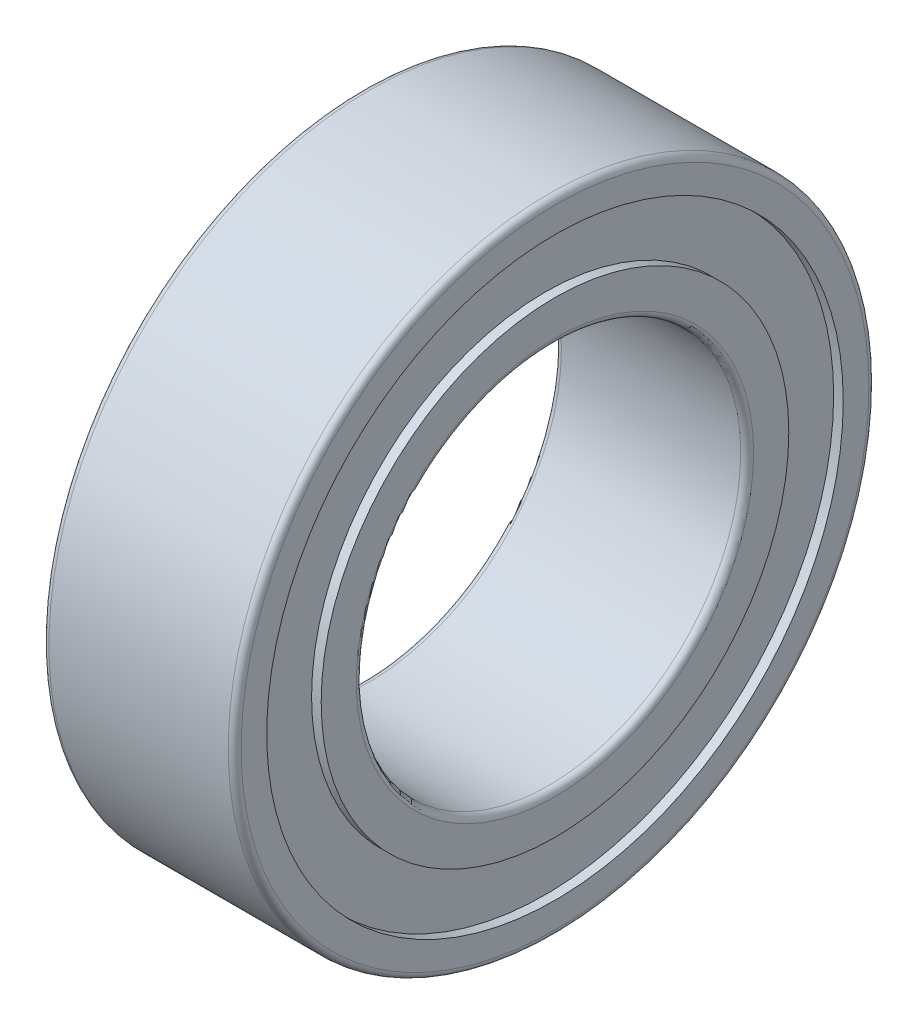
ISO-10303-21;
HEADER;
FILE_DESCRIPTION(('STEP AP214'),'2;1');
FILE_NAME('part.step','',(''),(''),'','','');
FILE_SCHEMA(('AUTOMOTIVE_DESIGN { 1 0 10303 214 1 1 1 1 }'));
ENDSEC;
DATA;
#1=APPLICATION_CONTEXT('core data for automotive mechanical design processes');
#2=APPLICATION_PROTOCOL_DEFINITION('international standard','automotive_design',2000,#1);
#3=PRODUCT_CONTEXT('',#1,'mechanical');
#4=PRODUCT('Part','Part','',(#3));
#5=PRODUCT_RELATED_PRODUCT_CATEGORY('part','',(#4));
#6=PRODUCT_DEFINITION_FORMATION('','',#4);
#7=PRODUCT_DEFINITION_CONTEXT('part definition',#1,'design');
#8=PRODUCT_DEFINITION('design','',#6,#7);
#9=PRODUCT_DEFINITION_SHAPE('','',#8);
#10=(LENGTH_UNIT() NAMED_UNIT(*) SI_UNIT(.MILLI.,.METRE.));
#11=(NAMED_UNIT(*) PLANE_ANGLE_UNIT() SI_UNIT($,.RADIAN.));
#12=(NAMED_UNIT(*) SI_UNIT($,.STERADIAN.) SOLID_ANGLE_UNIT());
#13=UNCERTAINTY_MEASURE_WITH_UNIT(LENGTH_MEASURE(1.E-05),#10,'distance_accuracy_value','');
#14=(GEOMETRIC_REPRESENTATION_CONTEXT(3) GLOBAL_UNCERTAINTY_ASSIGNED_CONTEXT((#13)) GLOBAL_UNIT_ASSIGNED_CONTEXT((#10,
#11,#12)) REPRESENTATION_CONTEXT('',''));
#15=CARTESIAN_POINT('',(0.,0.,0.));
#16=DIRECTION('',(0.,0.,1.));
#17=DIRECTION('',(1.,0.,0.));
#18=AXIS2_PLACEMENT_3D('',#15,#16,#17);
#19=CARTESIAN_POINT('',(-1.4,0.,0.));
#20=DIRECTION('',(1.,0.,0.));
#21=DIRECTION('',(0.,0.,-1.));
#22=AXIS2_PLACEMENT_3D('',#19,#20,#21);
#23=TOROIDAL_SURFACE('',#22,4.9,0.1);
#24=CARTESIAN_POINT('',(-1.5,0.,0.));
#25=DIRECTION('',(1.,0.,0.));
#26=DIRECTION('',(0.,0.,-1.));
#27=AXIS2_PLACEMENT_3D('',#24,#25,#26);
#28=CIRCLE('',#27,4.9);
#29=CARTESIAN_POINT('',(-1.5,0.,-4.9));
#30=VERTEX_POINT('',#29);
#31=EDGE_CURVE('E10',#30,#30,#28,.T.);
#32=ORIENTED_EDGE('',*,*,#31,.T.);
#33=EDGE_LOOP('',(#32));
#34=FACE_BOUND('',#33,.T.);
#35=CARTESIAN_POINT('',(-1.4,0.,0.));
#36=DIRECTION('',(1.,0.,0.));
#37=DIRECTION('',(0.,0.,-1.));
#38=AXIS2_PLACEMENT_3D('',#35,#36,#37);
#39=CIRCLE('',#38,5.);
#40=CARTESIAN_POINT('',(-1.4,0.,-5.));
#41=VERTEX_POINT('',#40);
#42=EDGE_CURVE('E124',#41,#41,#39,.T.);
#43=ORIENTED_EDGE('',*,*,#42,.F.);
#44=EDGE_LOOP('',(#43));
#45=FACE_BOUND('',#44,.T.);
#46=ADVANCED_FACE('F16',(#34,#45),#23,.T.);
#47=CARTESIAN_POINT('',(-1.5,4.5,0.));
#48=DIRECTION('',(1.,0.,0.));
#49=DIRECTION('',(0.,1.,0.));
#50=AXIS2_PLACEMENT_3D('',#47,#48,#49);
#51=PLANE('',#50);
#52=CARTESIAN_POINT('',(-1.5,0.,0.));
#53=DIRECTION('',(1.,0.,0.));
#54=DIRECTION('',(0.,0.,-1.));
#55=AXIS2_PLACEMENT_3D('',#52,#53,#54);
#56=CIRCLE('',#55,4.5);
#57=CARTESIAN_POINT('',(-1.5,0.,-4.5));
#58=VERTEX_POINT('',#57);
#59=EDGE_CURVE('E25',#58,#58,#56,.T.);
#60=ORIENTED_EDGE('',*,*,#59,.T.);
#61=EDGE_LOOP('',(#60));
#62=FACE_BOUND('',#61,.T.);
#63=ORIENTED_EDGE('',*,*,#31,.F.);
#64=EDGE_LOOP('',(#63));
#65=FACE_BOUND('',#64,.T.);
#66=ADVANCED_FACE('F203',(#62,#65),#51,.F.);
#67=CARTESIAN_POINT('',(1.5,0.,0.));
#68=DIRECTION('',(-1.,0.,0.));
#69=DIRECTION('',(0.,0.,-1.));
#70=AXIS2_PLACEMENT_3D('',#67,#68,#69);
#71=CYLINDRICAL_SURFACE('',#70,4.5);
#72=ORIENTED_EDGE('',*,*,#59,.F.);
#73=EDGE_LOOP('',(#72));
#74=FACE_BOUND('',#73,.T.);
#75=CARTESIAN_POINT('',(-1.35,0.,0.));
#76=DIRECTION('',(1.,0.,0.));
#77=DIRECTION('',(0.,0.,-1.));
#78=AXIS2_PLACEMENT_3D('',#75,#76,#77);
#79=CIRCLE('',#78,4.5);
#80=CARTESIAN_POINT('',(-1.35,0.,-4.5));
#81=VERTEX_POINT('',#80);
#82=EDGE_CURVE('E125',#81,#81,#79,.T.);
#83=ORIENTED_EDGE('',*,*,#82,.T.);
#84=EDGE_LOOP('',(#83));
#85=FACE_BOUND('',#84,.T.);
#86=ADVANCED_FACE('F208',(#74,#85),#71,.F.);
#87=CARTESIAN_POINT('',(-1.35,3.65,0.));
#88=DIRECTION('',(1.,0.,0.));
#89=DIRECTION('',(0.,1.,0.));
#90=AXIS2_PLACEMENT_3D('',#87,#88,#89);
#91=PLANE('',#90);
#92=CARTESIAN_POINT('',(-1.35,0.,0.));
#93=DIRECTION('',(1.,0.,0.));
#94=DIRECTION('',(0.,0.,-1.));
#95=AXIS2_PLACEMENT_3D('',#92,#93,#94);
#96=CIRCLE('',#95,3.65);
#97=CARTESIAN_POINT('',(-1.35,0.,-3.65));
#98=VERTEX_POINT('',#97);
#99=EDGE_CURVE('E116',#98,#98,#96,.T.);
#100=ORIENTED_EDGE('',*,*,#99,.T.);
#101=EDGE_LOOP('',(#100));
#102=FACE_BOUND('',#101,.T.);
#103=ORIENTED_EDGE('',*,*,#82,.F.);
#104=EDGE_LOOP('',(#103));
#105=FACE_BOUND('',#104,.T.);
#106=ADVANCED_FACE('F18',(#102,#105),#91,.F.);
#107=CARTESIAN_POINT('',(1.4,0.,0.));
#108=DIRECTION('',(1.,0.,0.));
#109=DIRECTION('',(0.,0.,-1.));
#110=AXIS2_PLACEMENT_3D('',#107,#108,#109);
#111=TOROIDAL_SURFACE('',#110,3.1,0.1);
#112=CARTESIAN_POINT('',(1.5,0.,0.));
#113=DIRECTION('',(1.,0.,0.));
#114=DIRECTION('',(0.,0.,-1.));
#115=AXIS2_PLACEMENT_3D('',#112,#113,#114);
#116=CIRCLE('',#115,3.1);
#117=CARTESIAN_POINT('',(1.5,0.,-3.1));
#118=VERTEX_POINT('',#117);
#119=EDGE_CURVE('E111',#118,#118,#116,.T.);
#120=ORIENTED_EDGE('',*,*,#119,.T.);
#121=EDGE_LOOP('',(#120));
#122=FACE_BOUND('',#121,.T.);
#123=CARTESIAN_POINT('',(1.4,0.,0.));
#124=DIRECTION('',(1.,0.,0.));
#125=DIRECTION('',(0.,0.,-1.));
#126=AXIS2_PLACEMENT_3D('',#123,#124,#125);
#127=CIRCLE('',#126,3.);
#128=CARTESIAN_POINT('',(1.4,0.,-3.));
#129=VERTEX_POINT('',#128);
#130=EDGE_CURVE('E128',#129,#129,#127,.T.);
#131=ORIENTED_EDGE('',*,*,#130,.F.);
#132=EDGE_LOOP('',(#131));
#133=FACE_BOUND('',#132,.T.);
#134=ADVANCED_FACE('F165',(#122,#133),#111,.T.);
#135=CARTESIAN_POINT('',(50.,0.,0.));
#136=DIRECTION('',(-1.,0.,0.));
#137=DIRECTION('',(0.,0.,-1.));
#138=AXIS2_PLACEMENT_3D('',#135,#136,#137);
#139=CYLINDRICAL_SURFACE('',#138,3.);
#140=ORIENTED_EDGE('',*,*,#130,.T.);
#141=EDGE_LOOP('',(#140));
#142=FACE_BOUND('',#141,.T.);
#143=CARTESIAN_POINT('',(-1.4,0.,0.));
#144=DIRECTION('',(1.,0.,0.));
#145=DIRECTION('',(0.,0.,-1.));
#146=AXIS2_PLACEMENT_3D('',#143,#144,#145);
#147=CIRCLE('',#146,3.);
#148=CARTESIAN_POINT('',(-1.4,0.,-3.));
#149=VERTEX_POINT('',#148);
#150=EDGE_CURVE('E131',#149,#149,#147,.T.);
#151=ORIENTED_EDGE('',*,*,#150,.F.);
#152=EDGE_LOOP('',(#151));
#153=FACE_BOUND('',#152,.T.);
#154=ADVANCED_FACE('F170',(#142,#153),#139,.F.);
#155=CARTESIAN_POINT('',(-1.4,0.,0.));
#156=DIRECTION('',(1.,0.,0.));
#157=DIRECTION('',(0.,0.,-1.));
#158=AXIS2_PLACEMENT_3D('',#155,#156,#157);
#159=TOROIDAL_SURFACE('',#158,3.1,0.1);
#160=ORIENTED_EDGE('',*,*,#150,.T.);
#161=EDGE_LOOP('',(#160));
#162=FACE_BOUND('',#161,.T.);
#163=CARTESIAN_POINT('',(-1.5,0.,0.));
#164=DIRECTION('',(1.,0.,0.));
#165=DIRECTION('',(0.,0.,-1.));
#166=AXIS2_PLACEMENT_3D('',#163,#164,#165);
#167=CIRCLE('',#166,3.1);
#168=CARTESIAN_POINT('',(-1.5,0.,-3.1));
#169=VERTEX_POINT('',#168);
#170=EDGE_CURVE('E115',#169,#169,#167,.T.);
#171=ORIENTED_EDGE('',*,*,#170,.F.);
#172=EDGE_LOOP('',(#171));
#173=FACE_BOUND('',#172,.T.);
#174=ADVANCED_FACE('F180',(#162,#173),#159,.T.);
#175=CARTESIAN_POINT('',(1.5,0.,0.));
#176=DIRECTION('',(-1.,0.,0.));
#177=DIRECTION('',(0.,0.,-1.));
#178=AXIS2_PLACEMENT_3D('',#175,#176,#177);
#179=CYLINDRICAL_SURFACE('',#178,3.65);
#180=ORIENTED_EDGE('',*,*,#99,.F.);
#181=EDGE_LOOP('',(#180));
#182=FACE_BOUND('',#181,.T.);
#183=CARTESIAN_POINT('',(-1.5,0.,0.));
#184=DIRECTION('',(1.,0.,0.));
#185=DIRECTION('',(0.,0.,-1.));
#186=AXIS2_PLACEMENT_3D('',#183,#184,#185);
#187=CIRCLE('',#186,3.65);
#188=CARTESIAN_POINT('',(-1.5,0.,-3.65));
#189=VERTEX_POINT('',#188);
#190=EDGE_CURVE('E117',#189,#189,#187,.T.);
#191=ORIENTED_EDGE('',*,*,#190,.T.);
#192=EDGE_LOOP('',(#191));
#193=FACE_BOUND('',#192,.T.);
#194=ADVANCED_FACE('F146',(#182,#193),#179,.T.);
#195=CARTESIAN_POINT('',(-1.5,0.,0.));
#196=DIRECTION('',(1.,0.,0.));
#197=DIRECTION('',(0.,1.,0.));
#198=AXIS2_PLACEMENT_3D('',#195,#196,#197);
#199=PLANE('',#198);
#200=ORIENTED_EDGE('',*,*,#170,.T.);
#201=EDGE_LOOP('',(#200));
#202=FACE_BOUND('',#201,.T.);
#203=ORIENTED_EDGE('',*,*,#190,.F.);
#204=EDGE_LOOP('',(#203));
#205=FACE_BOUND('',#204,.T.);
#206=ADVANCED_FACE('F140',(#202,#205),#199,.F.);
#207=CARTESIAN_POINT('',(1.5,0.,0.));
#208=DIRECTION('',(-1.,0.,0.));
#209=DIRECTION('',(0.,0.,-1.));
#210=AXIS2_PLACEMENT_3D('',#207,#208,#209);
#211=CYLINDRICAL_SURFACE('',#210,5.);
#212=CARTESIAN_POINT('',(1.4,0.,0.));
#213=DIRECTION('',(1.,0.,0.));
#214=DIRECTION('',(0.,0.,-1.));
#215=AXIS2_PLACEMENT_3D('',#212,#213,#214);
#216=CIRCLE('',#215,5.);
#217=CARTESIAN_POINT('',(1.4,0.,-5.));
#218=VERTEX_POINT('',#217);
#219=EDGE_CURVE('E121',#218,#218,#216,.T.);
#220=ORIENTED_EDGE('',*,*,#219,.F.);
#221=EDGE_LOOP('',(#220));
#222=FACE_BOUND('',#221,.T.);
#223=ORIENTED_EDGE('',*,*,#42,.T.);
#224=EDGE_LOOP('',(#223));
#225=FACE_BOUND('',#224,.T.);
#226=ADVANCED_FACE('F145',(#222,#225),#211,.T.);
#227=CARTESIAN_POINT('',(1.4,0.,0.));
#228=DIRECTION('',(1.,0.,0.));
#229=DIRECTION('',(0.,0.,-1.));
#230=AXIS2_PLACEMENT_3D('',#227,#228,#229);
#231=TOROIDAL_SURFACE('',#230,4.9,0.1);
#232=ORIENTED_EDGE('',*,*,#219,.T.);
#233=EDGE_LOOP('',(#232));
#234=FACE_BOUND('',#233,.T.);
#235=CARTESIAN_POINT('',(1.5,0.,0.));
#236=DIRECTION('',(1.,0.,0.));
#237=DIRECTION('',(0.,0.,-1.));
#238=AXIS2_PLACEMENT_3D('',#235,#236,#237);
#239=CIRCLE('',#238,4.9);
#240=CARTESIAN_POINT('',(1.5,0.,-4.9));
#241=VERTEX_POINT('',#240);
#242=EDGE_CURVE('E109',#241,#241,#239,.T.);
#243=ORIENTED_EDGE('',*,*,#242,.F.);
#244=EDGE_LOOP('',(#243));
#245=FACE_BOUND('',#244,.T.);
#246=ADVANCED_FACE('F225',(#234,#245),#231,.T.);
#247=CARTESIAN_POINT('',(1.5,4.9,0.));
#248=DIRECTION('',(-1.,0.,0.));
#249=DIRECTION('',(0.,0.,1.));
#250=AXIS2_PLACEMENT_3D('',#247,#248,#249);
#251=PLANE('',#250);
#252=CARTESIAN_POINT('',(1.5,0.,0.));
#253=DIRECTION('',(1.,0.,0.));
#254=DIRECTION('',(0.,0.,-1.));
#255=AXIS2_PLACEMENT_3D('',#252,#253,#254);
#256=CIRCLE('',#255,4.5);
#257=CARTESIAN_POINT('',(1.5,0.,-4.5));
#258=VERTEX_POINT('',#257);
#259=EDGE_CURVE('E102',#258,#258,#256,.T.);
#260=ORIENTED_EDGE('',*,*,#259,.F.);
#261=EDGE_LOOP('',(#260));
#262=FACE_BOUND('',#261,.T.);
#263=ORIENTED_EDGE('',*,*,#242,.T.);
#264=EDGE_LOOP('',(#263));
#265=FACE_BOUND('',#264,.T.);
#266=ADVANCED_FACE('F217',(#262,#265),#251,.F.);
#267=CARTESIAN_POINT('',(1.5,0.,0.));
#268=DIRECTION('',(-1.,0.,0.));
#269=DIRECTION('',(0.,0.,-1.));
#270=AXIS2_PLACEMENT_3D('',#267,#268,#269);
#271=CYLINDRICAL_SURFACE('',#270,4.5);
#272=CARTESIAN_POINT('',(1.35,0.,0.));
#273=DIRECTION('',(1.,0.,0.));
#274=DIRECTION('',(0.,0.,-1.));
#275=AXIS2_PLACEMENT_3D('',#272,#273,#274);
#276=CIRCLE('',#275,4.5);
#277=CARTESIAN_POINT('',(1.35,0.,-4.5));
#278=VERTEX_POINT('',#277);
#279=EDGE_CURVE('E98',#278,#278,#276,.T.);
#280=ORIENTED_EDGE('',*,*,#279,.F.);
#281=EDGE_LOOP('',(#280));
#282=FACE_BOUND('',#281,.T.);
#283=ORIENTED_EDGE('',*,*,#259,.T.);
#284=EDGE_LOOP('',(#283));
#285=FACE_BOUND('',#284,.T.);
#286=ADVANCED_FACE('F197',(#282,#285),#271,.F.);
#287=CARTESIAN_POINT('',(1.35,4.5,0.));
#288=DIRECTION('',(-1.,0.,0.));
#289=DIRECTION('',(0.,0.,1.));
#290=AXIS2_PLACEMENT_3D('',#287,#288,#289);
#291=PLANE('',#290);
#292=CARTESIAN_POINT('',(1.35,0.,0.));
#293=DIRECTION('',(1.,0.,0.));
#294=DIRECTION('',(0.,0.,-1.));
#295=AXIS2_PLACEMENT_3D('',#292,#293,#294);
#296=CIRCLE('',#295,3.65);
#297=CARTESIAN_POINT('',(1.35,0.,-3.65));
#298=VERTEX_POINT('',#297);
#299=EDGE_CURVE('E103',#298,#298,#296,.T.);
#300=ORIENTED_EDGE('',*,*,#299,.F.);
#301=EDGE_LOOP('',(#300));
#302=FACE_BOUND('',#301,.T.);
#303=ORIENTED_EDGE('',*,*,#279,.T.);
#304=EDGE_LOOP('',(#303));
#305=FACE_BOUND('',#304,.T.);
#306=ADVANCED_FACE('F99',(#302,#305),#291,.F.);
#307=CARTESIAN_POINT('',(1.5,0.,0.));
#308=DIRECTION('',(-1.,0.,0.));
#309=DIRECTION('',(0.,0.,-1.));
#310=AXIS2_PLACEMENT_3D('',#307,#308,#309);
#311=CYLINDRICAL_SURFACE('',#310,3.65);
#312=CARTESIAN_POINT('',(1.5,0.,0.));
#313=DIRECTION('',(1.,0.,0.));
#314=DIRECTION('',(0.,0.,-1.));
#315=AXIS2_PLACEMENT_3D('',#312,#313,#314);
#316=CIRCLE('',#315,3.65);
#317=CARTESIAN_POINT('',(1.5,0.,-3.65));
#318=VERTEX_POINT('',#317);
#319=EDGE_CURVE('E310',#318,#318,#316,.T.);
#320=ORIENTED_EDGE('',*,*,#319,.F.);
#321=EDGE_LOOP('',(#320));
#322=FACE_BOUND('',#321,.T.);
#323=ORIENTED_EDGE('',*,*,#299,.T.);
#324=EDGE_LOOP('',(#323));
#325=FACE_BOUND('',#324,.T.);
#326=ADVANCED_FACE('F159',(#322,#325),#311,.T.);
#327=CARTESIAN_POINT('',(1.5,3.65,0.));
#328=DIRECTION('',(-1.,0.,0.));
#329=DIRECTION('',(0.,0.,1.));
#330=AXIS2_PLACEMENT_3D('',#327,#328,#329);
#331=PLANE('',#330);
#332=ORIENTED_EDGE('',*,*,#119,.F.);
#333=EDGE_LOOP('',(#332));
#334=FACE_BOUND('',#333,.T.);
#335=ORIENTED_EDGE('',*,*,#319,.T.);
#336=EDGE_LOOP('',(#335));
#337=FACE_BOUND('',#336,.T.);
#338=ADVANCED_FACE('F154',(#334,#337),#331,.F.);
#339=CLOSED_SHELL('',(#46,#66,#86,#106,#134,#154,#174,#194,#206,#226,#246,#266,#286,#306,#326,#338));
#340=MANIFOLD_SOLID_BREP('B1',#339);
#341=ADVANCED_BREP_SHAPE_REPRESENTATION('',(#18,#340),#14);
#342=SHAPE_DEFINITION_REPRESENTATION(#9,#341);
ENDSEC;
END-ISO-10303-21;
